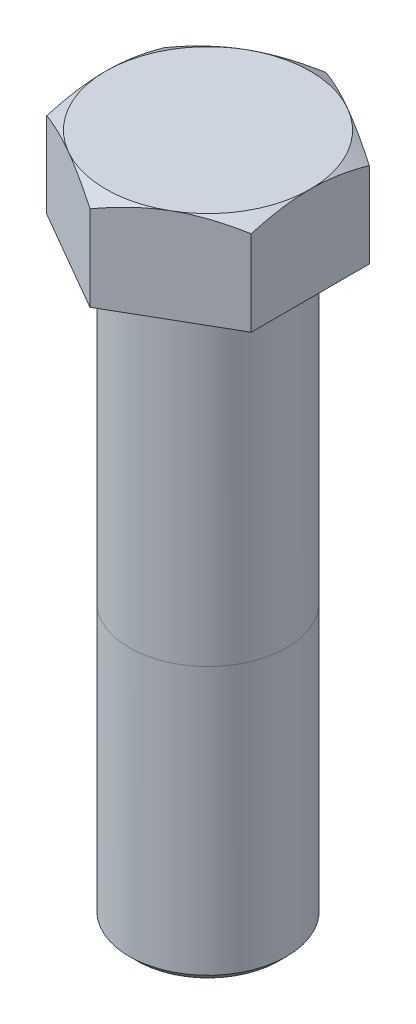
ISO-10303-21;
HEADER;
FILE_DESCRIPTION(('STEP AP214'),'2;1');
FILE_NAME('part.step','',(''),(''),'','','');
FILE_SCHEMA(('AUTOMOTIVE_DESIGN { 1 0 10303 214 1 1 1 1 }'));
ENDSEC;
DATA;
#1=APPLICATION_CONTEXT('core data for automotive mechanical design processes');
#2=APPLICATION_PROTOCOL_DEFINITION('international standard','automotive_design',2000,#1);
#3=PRODUCT_CONTEXT('',#1,'mechanical');
#4=PRODUCT('Part','Part','',(#3));
#5=PRODUCT_RELATED_PRODUCT_CATEGORY('part','',(#4));
#6=PRODUCT_DEFINITION_FORMATION('','',#4);
#7=PRODUCT_DEFINITION_CONTEXT('part definition',#1,'design');
#8=PRODUCT_DEFINITION('design','',#6,#7);
#9=PRODUCT_DEFINITION_SHAPE('','',#8);
#10=(LENGTH_UNIT() NAMED_UNIT(*) SI_UNIT(.MILLI.,.METRE.));
#11=(NAMED_UNIT(*) PLANE_ANGLE_UNIT() SI_UNIT($,.RADIAN.));
#12=(NAMED_UNIT(*) SI_UNIT($,.STERADIAN.) SOLID_ANGLE_UNIT());
#13=UNCERTAINTY_MEASURE_WITH_UNIT(LENGTH_MEASURE(1.E-05),#10,'distance_accuracy_value','');
#14=(GEOMETRIC_REPRESENTATION_CONTEXT(3) GLOBAL_UNCERTAINTY_ASSIGNED_CONTEXT((#13)) GLOBAL_UNIT_ASSIGNED_CONTEXT((#10,
#11,#12)) REPRESENTATION_CONTEXT('',''));
#15=CARTESIAN_POINT('',(0.,0.,0.));
#16=DIRECTION('',(0.,0.,1.));
#17=DIRECTION('',(1.,0.,0.));
#18=AXIS2_PLACEMENT_3D('',#15,#16,#17);
#19=CARTESIAN_POINT('',(0.,-75.,0.));
#20=DIRECTION('',(0.,1.,0.));
#21=DIRECTION('',(0.,0.,1.));
#22=AXIS2_PLACEMENT_3D('',#19,#20,#21);
#23=CYLINDRICAL_SURFACE('',#22,10.);
#24=CARTESIAN_POINT('',(0.,-74.,0.));
#25=DIRECTION('',(0.,-1.,0.));
#26=DIRECTION('',(0.,0.,-1.));
#27=AXIS2_PLACEMENT_3D('',#24,#25,#26);
#28=CIRCLE('',#27,10.);
#29=CARTESIAN_POINT('',(0.,-74.,-10.));
#30=VERTEX_POINT('',#29);
#31=EDGE_CURVE('E246',#30,#30,#28,.F.);
#32=ORIENTED_EDGE('',*,*,#31,.T.);
#33=EDGE_LOOP('',(#32));
#34=FACE_BOUND('',#33,.T.);
#35=CARTESIAN_POINT('',(0.,-40.,0.));
#36=DIRECTION('',(0.,1.,0.));
#37=DIRECTION('',(0.,0.,1.));
#38=AXIS2_PLACEMENT_3D('',#35,#36,#37);
#39=CIRCLE('',#38,10.);
#40=CARTESIAN_POINT('',(9.99999999999998,-40.,0.));
#41=VERTEX_POINT('',#40);
#42=CARTESIAN_POINT('',(-10.,-40.,0.));
#43=VERTEX_POINT('',#42);
#44=EDGE_CURVE('E14',#41,#43,#39,.T.);
#45=ORIENTED_EDGE('',*,*,#44,.F.);
#46=EDGE_CURVE('E51',#43,#41,#39,.T.);
#47=ORIENTED_EDGE('',*,*,#46,.F.);
#48=EDGE_LOOP('',(#45,#47));
#49=FACE_BOUND('',#48,.T.);
#50=ADVANCED_FACE('F47',(#34,#49),#23,.T.);
#51=CARTESIAN_POINT('',(13.,12.,7.50555349946511));
#52=DIRECTION('',(-1.,0.,0.));
#53=DIRECTION('',(0.,0.,1.));
#54=AXIS2_PLACEMENT_3D('',#51,#52,#53);
#55=PLANE('',#54);
#56=CARTESIAN_POINT('',(13.,5.47302312919701,-20.5362052428753));
#57=CARTESIAN_POINT('',(12.9999999999999,5.6123181993156,-20.2506559799709));
#58=CARTESIAN_POINT('',(12.9999999999999,5.75094643819101,-19.9647815771176));
#59=CARTESIAN_POINT('',(12.9999999999999,6.0267189120986,-19.3923147600184));
#60=CARTESIAN_POINT('',(12.9999999999999,6.16386313329287,-19.1057223391078));
#61=CARTESIAN_POINT('',(12.9999999999999,6.57287807441499,-18.2446950824058));
#62=CARTESIAN_POINT('',(12.9999999999999,6.8422924694262,-17.6690891780608));
#63=CARTESIAN_POINT('',(12.9999999999999,7.37438213181202,-16.5111922340489));
#64=CARTESIAN_POINT('',(12.9999999999999,7.63701584924481,-15.9288820570642));
#65=CARTESIAN_POINT('',(12.9999999999999,8.15202747920568,-14.7597595446431));
#66=CARTESIAN_POINT('',(12.9999999999999,8.40440585273383,-14.1729474129924));
#67=CARTESIAN_POINT('',(12.9999999999999,8.9046256550839,-12.9736996469937));
#68=CARTESIAN_POINT('',(12.9999999999999,9.1520156484003,-12.3610747680026));
#69=CARTESIAN_POINT('',(12.9999999999999,9.62896591516343,-11.1287938015243));
#70=CARTESIAN_POINT('',(13.,9.85852424154899,-10.5091369546508));
#71=CARTESIAN_POINT('',(12.9999999999999,10.2940551669296,-9.26286823696078));
#72=CARTESIAN_POINT('',(12.9999999999999,10.5000724096716,-8.63627208859659));
#73=CARTESIAN_POINT('',(13.,10.8821740841937,-7.37404234614446));
#74=CARTESIAN_POINT('',(13.,11.0582675535848,-6.73841154378601));
#75=CARTESIAN_POINT('',(13.,11.2933057679572,-5.77979070520041));
#76=CARTESIAN_POINT('',(13.,11.3666331056824,-5.46030810975037));
#77=CARTESIAN_POINT('',(12.9999999999999,11.5027463999533,-4.81909359478802));
#78=CARTESIAN_POINT('',(12.9999999999999,11.5655325543713,-4.49736171761586));
#79=CARTESIAN_POINT('',(13.,11.679479670437,-3.85184384003502));
#80=CARTESIAN_POINT('',(13.,11.7306409256578,-3.52805789171178));
#81=CARTESIAN_POINT('',(13.,11.820333330158,-2.87874422062102));
#82=CARTESIAN_POINT('',(13.,11.8588650554156,-2.55321657797298));
#83=CARTESIAN_POINT('',(13.,11.9220283095709,-1.9052855999215));
#84=CARTESIAN_POINT('',(13.,11.946842114415,-1.58290014435152));
#85=CARTESIAN_POINT('',(13.,11.9827999679473,-0.937368113080149));
#86=CARTESIAN_POINT('',(13.,11.9939442543354,-0.61422155071159));
#87=CARTESIAN_POINT('',(13.,12.0022958533878,0.0322565326583396));
#88=CARTESIAN_POINT('',(13.,11.9995030984212,0.355588054549631));
#89=CARTESIAN_POINT('',(13.,11.9800526045551,1.00183711607913));
#90=CARTESIAN_POINT('',(13.,11.9633942530549,1.32475463679487));
#91=CARTESIAN_POINT('',(13.,11.9078771446615,2.0896150790429));
#92=CARTESIAN_POINT('',(13.,11.8630640449832,2.53113595347257));
#93=CARTESIAN_POINT('',(13.,11.7498781130193,3.41112300001199));
#94=CARTESIAN_POINT('',(13.,11.6815023932615,3.84958879101613));
#95=CARTESIAN_POINT('',(13.,11.4446391068226,5.15976502996832));
#96=CARTESIAN_POINT('',(13.,11.2444502612508,6.02583270000573));
#97=CARTESIAN_POINT('',(13.,10.8944076885502,7.32162047581373));
#98=CARTESIAN_POINT('',(13.,10.7676827319449,7.757977110938));
#99=CARTESIAN_POINT('',(13.,10.5003525824954,8.62645996834518));
#100=CARTESIAN_POINT('',(13.,10.3597472804184,9.05858615730673));
#101=CARTESIAN_POINT('',(13.,10.0669695445201,9.91873384330734));
#102=CARTESIAN_POINT('',(13.,9.91480025359072,10.3467564202751));
#103=CARTESIAN_POINT('',(13.,9.60076374475677,11.1992081828991));
#104=CARTESIAN_POINT('',(13.,9.43889676356815,11.6236374559779));
#105=CARTESIAN_POINT('',(13.,9.12870574483411,12.4140886026434));
#106=CARTESIAN_POINT('',(13.,8.98137287033611,12.7805010710647));
#107=CARTESIAN_POINT('',(13.,8.68142119135482,13.5111591236827));
#108=CARTESIAN_POINT('',(13.,8.52880229582055,13.8754046704277));
#109=CARTESIAN_POINT('',(13.,8.06411516601984,14.9653023909476));
#110=CARTESIAN_POINT('',(13.,7.74524090533267,15.6880541659425));
#111=CARTESIAN_POINT('',(13.,7.09376791723235,17.1276583875994));
#112=CARTESIAN_POINT('',(13.,6.76116364311448,17.8445083069251));
#113=CARTESIAN_POINT('',(13.,6.08554657750159,19.2732364565627));
#114=CARTESIAN_POINT('',(13.,5.74253424136572,19.9851149027082));
#115=CARTESIAN_POINT('',(13.,5.04782369692459,21.4060922865842));
#116=CARTESIAN_POINT('',(13.,4.69611186951812,22.1151845489984));
#117=CARTESIAN_POINT('',(13.,3.986261020148,23.5301475016115));
#118=CARTESIAN_POINT('',(13.,3.62812194056714,24.2360181628591));
#119=CARTESIAN_POINT('',(13.,2.90677965391014,25.644957694335));
#120=CARTESIAN_POINT('',(13.,2.54357763785105,26.3480271751018));
#121=CARTESIAN_POINT('',(13.,1.81299046215743,27.7519839052317));
#122=CARTESIAN_POINT('',(13.,1.44560531694706,28.452871162109));
#123=CARTESIAN_POINT('',(13.,0.418343166699492,30.4010576783747));
#124=CARTESIAN_POINT('',(13.,-0.245263220807709,31.6463900252864));
#125=CARTESIAN_POINT('',(13.,-1.58036517961358,34.1329142743419));
#126=CARTESIAN_POINT('',(13.,-2.25186126679987,35.3741058988443));
#127=CARTESIAN_POINT('',(13.,-3.59837608390633,37.8489823521331));
#128=CARTESIAN_POINT('',(13.,-4.27337443605208,39.0826782750488));
#129=CARTESIAN_POINT('',(13.,-5.28919201118936,40.9313296910316));
#130=CARTESIAN_POINT('',(13.,-5.6283372544577,41.5472062363514));
#131=CARTESIAN_POINT('',(13.,-6.30761910492575,42.7784114282018));
#132=CARTESIAN_POINT('',(13.,-6.64775571090814,43.3937400754039));
#133=CARTESIAN_POINT('',(13.0000000000001,-6.98832622530923,44.0088285303353));
#134=B_SPLINE_CURVE_WITH_KNOTS('',3,(#56,#57,#58,#59,#60,#61,#62,#63,#64,#65,#66,#67,#68,#69,
#70,#71,#72,#73,#74,#75,#76,#77,#78,#79,#80,#81,#82,#83,#84,#85,#86,#87,#88,#89,#90,#91,#92,#93,
#94,#95,#96,#97,#98,#99,#100,#101,#102,#103,#104,#105,#106,#107,#108,#109,#110,#111,#112,#113,
#114,#115,#116,#117,#118,#119,#120,#121,#122,#123,#124,#125,#126,#127,#128,#129,#130,#131,#132,
#133),.UNSPECIFIED.,.F.,.F.,(4,2,2,2,2,2,2,2,2,2,2,2,2,2,2,2,2,2,2,2,2,2,2,2,2,2,2,2,2,2,2,2,2,
2,2,2,2,2,4),(0.,0.953137143504383,1.90628316701682,3.81283878003332,5.72915255951741,
7.64538010101131,9.62723751771698,11.6093110325104,13.5875610336447,15.5652124955241,
16.5484355945027,17.5316402349971,18.5148200430678,19.4979550063206,20.4676917853032,
21.4374117012485,22.4071363228599,23.3769037904805,24.7075277474215,26.0383148231711,
28.7011524606477,30.0641851061431,31.4272284790177,32.7899027161321,34.1525437045621,
35.3372707337203,36.5220181797948,38.8917114597028,41.2623716102642,43.6329281921008,
46.0074657211912,48.3820245475033,50.7560339004247,53.1300350698181,57.3633151213702,
61.5968735342,65.8157059354961,67.9249493924729,70.034190260563),.UNSPECIFIED.);
#135=CARTESIAN_POINT('',(13.,10.8388868327985,7.50555349946511));
#136=VERTEX_POINT('',#135);
#137=CARTESIAN_POINT('',(13.,12.,0.));
#138=VERTEX_POINT('',#137);
#139=EDGE_CURVE('E120',#136,#138,#134,.F.);
#140=ORIENTED_EDGE('',*,*,#139,.F.);
#141=DIRECTION('',(0.,-1.,0.));
#142=VECTOR('',#141,1.);
#143=CARTESIAN_POINT('',(13.,12.,7.50555349946511));
#144=LINE('',#143,#142);
#145=CARTESIAN_POINT('',(13.,0.,7.50555349946511));
#146=VERTEX_POINT('',#145);
#147=EDGE_CURVE('E261',#136,#146,#144,.T.);
#148=ORIENTED_EDGE('',*,*,#147,.T.);
#149=DIRECTION('',(0.,0.,-1.));
#150=VECTOR('',#149,1.);
#151=CARTESIAN_POINT('',(13.,0.,7.50555349946511));
#152=LINE('',#151,#150);
#153=CARTESIAN_POINT('',(13.,0.,-7.50555349946516));
#154=VERTEX_POINT('',#153);
#155=EDGE_CURVE('E130',#146,#154,#152,.T.);
#156=ORIENTED_EDGE('',*,*,#155,.T.);
#157=DIRECTION('',(0.,-1.,0.));
#158=VECTOR('',#157,1.);
#159=CARTESIAN_POINT('',(13.,12.,-7.50555349946516));
#160=LINE('',#159,#158);
#161=CARTESIAN_POINT('',(13.,10.8388868327985,-7.50555349946516));
#162=VERTEX_POINT('',#161);
#163=EDGE_CURVE('E155',#162,#154,#160,.T.);
#164=ORIENTED_EDGE('',*,*,#163,.F.);
#165=EDGE_CURVE('E131',#138,#162,#134,.F.);
#166=ORIENTED_EDGE('',*,*,#165,.F.);
#167=EDGE_LOOP('',(#140,#148,#156,#164,#166));
#168=FACE_BOUND('',#167,.T.);
#169=ADVANCED_FACE('F153',(#168),#55,.F.);
#170=CARTESIAN_POINT('',(13.,12.,-7.50555349946516));
#171=DIRECTION('',(-0.5,0.,0.866025403784439));
#172=DIRECTION('',(0.866025403784439,0.,0.500000000000001));
#173=AXIS2_PLACEMENT_3D('',#170,#171,#172);
#174=PLANE('',#173);
#175=CARTESIAN_POINT('',(13.0001999999999,10.8388201653626,-7.50543802941131));
#176=CARTESIAN_POINT('',(12.7144648850697,10.9340592607737,-7.67040727493323));
#177=CARTESIAN_POINT('',(12.4276152495064,11.0249766112314,-7.83601998924266));
#178=CARTESIAN_POINT('',(11.8516157789271,11.1969665208061,-8.16857343863473));
#179=CARTESIAN_POINT('',(11.5624652205073,11.2780358419941,-8.33551459137472));
#180=CARTESIAN_POINT('',(10.9813050785948,11.4292399600852,-8.67104755575018));
#181=CARTESIAN_POINT('',(10.6892904094912,11.4993488854031,-8.83964230356445));
#182=CARTESIAN_POINT('',(10.1032319146354,11.6271267685936,-9.17800333333032));
#183=CARTESIAN_POINT('',(9.80918820563259,11.684796436153,-9.34776954787661));
#184=CARTESIAN_POINT('',(9.22660617586339,11.7852429107094,-9.6841234395889));
#185=CARTESIAN_POINT('',(8.93811110693475,11.8283521763088,-9.85068614529472));
#186=CARTESIAN_POINT('',(8.35979901670926,11.9006370020862,-10.184574786262));
#187=CARTESIAN_POINT('',(8.06998197007602,11.9298122940701,-10.3519007361515));
#188=CARTESIAN_POINT('',(7.48986101370733,11.9734925129694,-10.6868337264735));
#189=CARTESIAN_POINT('',(7.19955809509021,11.9880148729439,-10.8544401946836));
#190=CARTESIAN_POINT('',(6.61868426662947,12.0020769130485,-11.1898078559106));
#191=CARTESIAN_POINT('',(6.32811336534372,12.0016170561171,-11.3575690439866));
#192=CARTESIAN_POINT('',(5.78489148969083,11.9867610928037,-11.6711983401245));
#193=CARTESIAN_POINT('',(5.53220180638652,11.9741770566899,-11.8170887968017));
#194=CARTESIAN_POINT('',(5.02740368266753,11.9379156201946,-12.1085341294173));
#195=CARTESIAN_POINT('',(4.77529528463438,11.9142374351328,-12.2540889808867));
#196=CARTESIAN_POINT('',(4.27179666903782,11.8562005500844,-12.544784042138));
#197=CARTESIAN_POINT('',(4.02040721834163,11.8218330287471,-12.6899238091688));
#198=CARTESIAN_POINT('',(3.51880688407628,11.7430204493894,-12.9795228971825));
#199=CARTESIAN_POINT('',(3.26859608181068,11.6985747062674,-13.1239821712247));
#200=CARTESIAN_POINT('',(2.50906721513482,11.5489966092185,-13.5624963668573));
#201=CARTESIAN_POINT('',(2.00194863635103,11.4289496815176,-13.8552814148292));
#202=CARTESIAN_POINT('',(0.995273291325103,11.1564921660602,-14.4364856962665));
#203=CARTESIAN_POINT('',(0.49570363599023,11.0041455670387,-14.7249123712531));
#204=CARTESIAN_POINT('',(-0.000200000000005751,10.8388201653626,-15.0112224689841));
#205=B_SPLINE_CURVE_WITH_KNOTS('',3,(#175,#176,#177,#178,#179,#180,#181,#182,#183,#184,#185,
#186,#187,#188,#189,#190,#191,#192,#193,#194,#195,#196,#197,#198,#199,#200,#201,#202,#203,#204),
.UNSPECIFIED.,.F.,.F.,(4,2,2,2,2,2,2,2,2,2,2,2,2,2,4),(0.,1.03025461984709,2.0608470650412,
3.09383660213902,4.12676718933493,5.13420251692741,6.14165723434359,7.14791193250861,
8.15413553822912,9.03008081731203,9.90608806065232,10.7828201537635,11.6596118636231,
13.4517531627236,15.240376691212),.UNSPECIFIED.);
#206=CARTESIAN_POINT('',(6.50000000000001,12.,-11.2583302491977));
#207=VERTEX_POINT('',#206);
#208=EDGE_CURVE('E138',#162,#207,#205,.T.);
#209=ORIENTED_EDGE('',*,*,#208,.F.);
#210=ORIENTED_EDGE('',*,*,#163,.T.);
#211=DIRECTION('',(-0.866025403784439,0.,-0.500000000000001));
#212=VECTOR('',#211,1.);
#213=CARTESIAN_POINT('',(13.,0.,-7.50555349946516));
#214=LINE('',#213,#212);
#215=CARTESIAN_POINT('',(0.,0.,-15.0111069989303));
#216=VERTEX_POINT('',#215);
#217=EDGE_CURVE('E274',#154,#216,#214,.T.);
#218=ORIENTED_EDGE('',*,*,#217,.T.);
#219=DIRECTION('',(0.,-1.,0.));
#220=VECTOR('',#219,1.);
#221=CARTESIAN_POINT('',(0.,12.,-15.0111069989303));
#222=LINE('',#221,#220);
#223=CARTESIAN_POINT('',(0.,10.8388868327985,-15.0111069989303));
#224=VERTEX_POINT('',#223);
#225=EDGE_CURVE('E253',#224,#216,#222,.T.);
#226=ORIENTED_EDGE('',*,*,#225,.F.);
#227=EDGE_CURVE('E156',#207,#224,#205,.T.);
#228=ORIENTED_EDGE('',*,*,#227,.F.);
#229=EDGE_LOOP('',(#209,#210,#218,#226,#228));
#230=FACE_BOUND('',#229,.T.);
#231=ADVANCED_FACE('F174',(#230),#174,.F.);
#232=CARTESIAN_POINT('',(0.,12.,-15.0111069989303));
#233=DIRECTION('',(0.500000000000001,0.,0.866025403784439));
#234=DIRECTION('',(0.866025403784439,0.,-0.500000000000001));
#235=AXIS2_PLACEMENT_3D('',#232,#233,#234);
#236=PLANE('',#235);
#237=CARTESIAN_POINT('',(0.000200000000005751,10.8388201653626,-15.0112224689841));
#238=CARTESIAN_POINT('',(-0.285535114930224,10.9340592607736,-14.8462532234622));
#239=CARTESIAN_POINT('',(-0.572384750493512,11.0249766112314,-14.6806405091528));
#240=CARTESIAN_POINT('',(-1.14838422107285,11.1969665208061,-14.3480870597607));
#241=CARTESIAN_POINT('',(-1.43753477949264,11.2780358419941,-14.1811459070207));
#242=CARTESIAN_POINT('',(-2.01869492140515,11.4292399600852,-13.8456129426453));
#243=CARTESIAN_POINT('',(-2.31070959050871,11.4993488854031,-13.677018194831));
#244=CARTESIAN_POINT('',(-2.89676808536453,11.6271267685936,-13.3386571650651));
#245=CARTESIAN_POINT('',(-3.19081179436734,11.684796436153,-13.1688909505188));
#246=CARTESIAN_POINT('',(-3.77339382413655,11.7852429107094,-12.8325370588065));
#247=CARTESIAN_POINT('',(-4.06188889306518,11.8283521763088,-12.6659743531007));
#248=CARTESIAN_POINT('',(-4.64020098329068,11.9006370020862,-12.3320857121334));
#249=CARTESIAN_POINT('',(-4.93001802992392,11.9298122940701,-12.164759762244));
#250=CARTESIAN_POINT('',(-5.5101389862926,11.9734925129694,-11.829826771922));
#251=CARTESIAN_POINT('',(-5.80044190490972,11.9880148729439,-11.6622203037118));
#252=CARTESIAN_POINT('',(-6.38131573337048,12.0020769130485,-11.3268526424848));
#253=CARTESIAN_POINT('',(-6.67188663465623,12.0016170561171,-11.1590914544088));
#254=CARTESIAN_POINT('',(-7.21510851030913,11.9867610928037,-10.8454621582709));
#255=CARTESIAN_POINT('',(-7.46779819361343,11.97417705669,-10.6995717015937));
#256=CARTESIAN_POINT('',(-7.97259631733242,11.9379156201946,-10.4081263689782));
#257=CARTESIAN_POINT('',(-8.22470471536557,11.9142374351328,-10.2625715175088));
#258=CARTESIAN_POINT('',(-8.72820333096214,11.8562005500845,-9.97187645625747));
#259=CARTESIAN_POINT('',(-8.97959278165833,11.8218330287471,-9.82673668922659));
#260=CARTESIAN_POINT('',(-9.48119311592368,11.7430204493894,-9.53713760121289));
#261=CARTESIAN_POINT('',(-9.73140391818928,11.6985747062674,-9.39267832717069));
#262=CARTESIAN_POINT('',(-10.4909327848651,11.5489966092185,-8.95416413153808));
#263=CARTESIAN_POINT('',(-10.9980513636489,11.4289496815176,-8.6613790835662));
#264=CARTESIAN_POINT('',(-12.0047267086749,11.1564921660602,-8.08017480212892));
#265=CARTESIAN_POINT('',(-12.5042963640098,11.0041455670387,-7.79174812714237));
#266=CARTESIAN_POINT('',(-13.0002,10.8388201653626,-7.50543802941131));
#267=B_SPLINE_CURVE_WITH_KNOTS('',3,(#237,#238,#239,#240,#241,#242,#243,#244,#245,#246,#247,
#248,#249,#250,#251,#252,#253,#254,#255,#256,#257,#258,#259,#260,#261,#262,#263,#264,#265,#266),
.UNSPECIFIED.,.F.,.F.,(4,2,2,2,2,2,2,2,2,2,2,2,2,2,4),(0.,1.03025461984709,2.06084706504121,
3.09383660213902,4.12676718933494,5.13420251692743,6.1416572343436,7.14791193250863,
8.15413553822914,9.03008081731206,9.90608806065236,10.7828201537635,11.6596118636232,
13.4517531627237,15.2403766912121),.UNSPECIFIED.);
#268=CARTESIAN_POINT('',(-6.50000000000006,12.,-11.2583302491978));
#269=VERTEX_POINT('',#268);
#270=EDGE_CURVE('E192',#224,#269,#267,.T.);
#271=ORIENTED_EDGE('',*,*,#270,.F.);
#272=ORIENTED_EDGE('',*,*,#225,.T.);
#273=DIRECTION('',(-0.866025403784439,0.,0.500000000000001));
#274=VECTOR('',#273,1.);
#275=CARTESIAN_POINT('',(0.,0.,-15.0111069989303));
#276=LINE('',#275,#274);
#277=CARTESIAN_POINT('',(-13.0000000000001,0.,-7.50555349946515));
#278=VERTEX_POINT('',#277);
#279=EDGE_CURVE('E272',#216,#278,#276,.T.);
#280=ORIENTED_EDGE('',*,*,#279,.T.);
#281=DIRECTION('',(0.,-1.,0.));
#282=VECTOR('',#281,1.);
#283=CARTESIAN_POINT('',(-13.0000000000001,12.,-7.50555349946515));
#284=LINE('',#283,#282);
#285=CARTESIAN_POINT('',(-13.0000000000001,10.8388868327985,-7.50555349946515));
#286=VERTEX_POINT('',#285);
#287=EDGE_CURVE('E255',#286,#278,#284,.T.);
#288=ORIENTED_EDGE('',*,*,#287,.F.);
#289=EDGE_CURVE('E187',#269,#286,#267,.T.);
#290=ORIENTED_EDGE('',*,*,#289,.F.);
#291=EDGE_LOOP('',(#271,#272,#280,#288,#290));
#292=FACE_BOUND('',#291,.T.);
#293=ADVANCED_FACE('F178',(#292),#236,.F.);
#294=CARTESIAN_POINT('',(-13.0000000000001,12.,-7.50555349946515));
#295=DIRECTION('',(1.,0.,0.));
#296=DIRECTION('',(0.,0.,-1.));
#297=AXIS2_PLACEMENT_3D('',#294,#295,#296);
#298=PLANE('',#297);
#299=CARTESIAN_POINT('',(-13.0000000000001,5.47302311942427,-20.5362052629085));
#300=CARTESIAN_POINT('',(-13.0000000000001,5.6123181897463,-20.2506559996668));
#301=CARTESIAN_POINT('',(-13.0000000000001,5.75094642882505,-19.964781596476));
#302=CARTESIAN_POINT('',(-13.0000000000001,6.02671890313898,-19.3923147787013));
#303=CARTESIAN_POINT('',(-13.0000000000001,6.16386312453624,-19.1057223574529));
#304=CARTESIAN_POINT('',(-13.0000000000001,6.57287806626668,-18.2446950997364));
#305=CARTESIAN_POINT('',(-13.0000000000001,6.8422924616825,-17.6690891947142));
#306=CARTESIAN_POINT('',(-13.0000000000001,7.37438212487768,-16.5111922493377));
#307=CARTESIAN_POINT('',(-13.0000000000001,7.63701584271513,-15.9288820716656));
#308=CARTESIAN_POINT('',(-13.0000000000001,8.15202747347874,-14.7597595578652));
#309=CARTESIAN_POINT('',(-13.0000000000001,8.40440584740494,-14.1729474255224));
#310=CARTESIAN_POINT('',(-13.0000000000001,8.90462565056392,-12.973699658084));
#311=CARTESIAN_POINT('',(-13.0000000000001,9.15201564429021,-12.3610747783447));
#312=CARTESIAN_POINT('',(-13.0000000000001,9.62896591185156,-11.1287938103579));
#313=CARTESIAN_POINT('',(-13.0000000000001,9.85852423862546,-10.5091369627242));
#314=CARTESIAN_POINT('',(-13.0000000000001,10.2940551647462,-9.26286824349996));
#315=CARTESIAN_POINT('',(-13.0000000000001,10.5000724078401,-8.63627209436172));
#316=CARTESIAN_POINT('',(-13.0000000000001,10.8821740830097,-7.37404235034036));
#317=CARTESIAN_POINT('',(-13.,11.0582675526963,-6.73841154718673));
#318=CARTESIAN_POINT('',(-13.,11.2933057674937,-5.7797907072017));
#319=CARTESIAN_POINT('',(-13.0000000000001,11.3666331053749,-5.46030811115524));
#320=CARTESIAN_POINT('',(-13.0000000000001,11.5027463999193,-4.81909359499143));
#321=CARTESIAN_POINT('',(-13.0000000000001,11.5655325544546,-4.49736171721424));
#322=CARTESIAN_POINT('',(-13.0000000000001,11.6794796707102,-3.8518438384165));
#323=CARTESIAN_POINT('',(-13.0000000000001,11.7306409260033,-3.52805788948138));
#324=CARTESIAN_POINT('',(-13.0000000000001,11.8203333305982,-2.87874421716142));
#325=CARTESIAN_POINT('',(-13.0000000000001,11.8588650558781,-2.55321657389604));
#326=CARTESIAN_POINT('',(-13.0000000000001,11.9220283100231,-1.9052855946228));
#327=CARTESIAN_POINT('',(-13.0000000000001,11.9468421148357,-1.58290013844844));
#328=CARTESIAN_POINT('',(-13.0000000000001,11.9827999682513,-0.937368105969223));
#329=CARTESIAN_POINT('',(-13.0000000000001,11.9939442545542,-0.614221542997186));
#330=CARTESIAN_POINT('',(-13.0000000000001,12.0022958533836,0.0322565415754331));
#331=CARTESIAN_POINT('',(-13.0000000000001,11.9995030982792,0.355588064065937));
#332=CARTESIAN_POINT('',(-13.0000000000001,11.9800526040882,1.00183712678611));
#333=CARTESIAN_POINT('',(-13.,11.9633942524011,1.32475464809332));
#334=CARTESIAN_POINT('',(-13.,11.9078771435481,2.08961509124377));
#335=CARTESIAN_POINT('',(-13.0000000000001,11.863064043606,2.53113596598188));
#336=CARTESIAN_POINT('',(-13.0000000000001,11.7498781111005,3.41112301312391));
#337=CARTESIAN_POINT('',(-13.0000000000001,11.6815023910652,3.84958880442221));
#338=CARTESIAN_POINT('',(-13.0000000000001,11.4446391037876,5.15976504424042));
#339=CARTESIAN_POINT('',(-13.0000000000001,11.2444502576496,6.02583271483174));
#340=CARTESIAN_POINT('',(-13.0000000000001,10.8944076841142,7.32162049146811));
#341=CARTESIAN_POINT('',(-13.0000000000001,10.7676827272287,7.75797712687464));
#342=CARTESIAN_POINT('',(-13.0000000000001,10.5003525772278,8.626459984843));
#343=CARTESIAN_POINT('',(-13.0000000000001,10.3597472748795,9.05858617408349));
#344=CARTESIAN_POINT('',(-13.0000000000001,10.0669695384487,9.91873386063978));
#345=CARTESIAN_POINT('',(-13.0000000000001,9.91480024725813,10.3467564378843));
#346=CARTESIAN_POINT('',(-13.,9.60076373791119,11.1992082010619));
#347=CARTESIAN_POINT('',(-12.9999999999999,9.4388967564708,11.6236374744174));
#348=CARTESIAN_POINT('',(-13.,9.12870573739348,12.4140886212969));
#349=CARTESIAN_POINT('',(-13.0000000000001,8.98137286280801,12.7805010896573));
#350=CARTESIAN_POINT('',(-13.0000000000001,8.68142118366587,13.5111591421578));
#351=CARTESIAN_POINT('',(-13.0000000000001,8.52880228805823,13.8754046888461));
#352=CARTESIAN_POINT('',(-13.0000000000001,8.06411515805513,14.9653024092016));
#353=CARTESIAN_POINT('',(-13.0000000000001,7.74524089725656,15.6880541840945));
#354=CARTESIAN_POINT('',(-13.0000000000001,7.09376790896714,17.1276584055583));
#355=CARTESIAN_POINT('',(-13.0000000000001,6.76116363477161,17.844508324793));
#356=CARTESIAN_POINT('',(-13.0000000000001,6.08554656902704,19.2732364742586));
#357=CARTESIAN_POINT('',(-13.0000000000001,5.74253423283716,19.9851149203229));
#358=CARTESIAN_POINT('',(-13.0000000000001,5.04782368830773,21.4060923040388));
#359=CARTESIAN_POINT('',(-13.0000000000001,4.69611186086705,22.1151845663742));
#360=CARTESIAN_POINT('',(-13.0000000000001,3.98626101144136,23.5301475188353));
#361=CARTESIAN_POINT('',(-13.0000000000001,3.62812193183916,24.2360181800098));
#362=CARTESIAN_POINT('',(-13.0000000000001,2.90677964514867,25.644957711345));
#363=CARTESIAN_POINT('',(-13.0000000000001,2.54357762907744,26.3480271920441));
#364=CARTESIAN_POINT('',(-13.0000000000001,1.81299045336684,27.7519839220423));
#365=CARTESIAN_POINT('',(-13.0000000000001,1.44560530815166,28.4528711788555));
#366=CARTESIAN_POINT('',(-13.0000000000001,0.418343157841397,30.4010576950551));
#367=CARTESIAN_POINT('',(-13.0000000000001,-0.245263229718481,31.6463900419673));
#368=CARTESIAN_POINT('',(-13.0000000000001,-1.58036518861903,34.1329142910288));
#369=CARTESIAN_POINT('',(-13.0000000000001,-2.25186127584733,35.3741059155367));
#370=CARTESIAN_POINT('',(-13.0000000000001,-3.59837609304068,37.8489823688588));
#371=CARTESIAN_POINT('',(-13.0000000000001,-4.27337444523145,39.0826782918024));
#372=CARTESIAN_POINT('',(-13.0000000000001,-5.28919202043271,40.9313297078291));
#373=CARTESIAN_POINT('',(-13.0000000000001,-5.62833726372186,41.5472062531641));
#374=CARTESIAN_POINT('',(-13.0000000000001,-6.30761911423045,42.7784114450453));
#375=CARTESIAN_POINT('',(-13.,-6.64775572023259,43.3937400922632));
#376=CARTESIAN_POINT('',(-13.,-6.98832623465298,44.0088285472104));
#377=B_SPLINE_CURVE_WITH_KNOTS('',3,(#299,#300,#301,#302,#303,#304,#305,#306,#307,#308,#309,
#310,#311,#312,#313,#314,#315,#316,#317,#318,#319,#320,#321,#322,#323,#324,#325,#326,#327,#328,
#329,#330,#331,#332,#333,#334,#335,#336,#337,#338,#339,#340,#341,#342,#343,#344,#345,#346,#347,
#348,#349,#350,#351,#352,#353,#354,#355,#356,#357,#358,#359,#360,#361,#362,#363,#364,#365,#366,
#367,#368,#369,#370,#371,#372,#373,#374,#375,#376),.UNSPECIFIED.,.F.,.F.,(4,2,2,2,2,2,2,2,2,2,2,
2,2,2,2,2,2,2,2,2,2,2,2,2,2,2,2,2,2,2,2,2,2,2,2,2,2,2,4),(0.,0.953137144681599,1.90628316937126,
3.81283878474253,5.72915256660556,7.64538011047822,9.62723752972566,11.6093110470617,
13.5875610507306,15.5652125151425,16.5484356159691,17.5316402583113,18.5148200682277,
19.4979550333258,20.4676918141073,21.4374117318513,22.4071363552623,23.3769038246823,
24.7075277826233,26.0383148593729,28.7011524988541,30.0641851453975,31.42722851932,
32.7899027574796,34.1525437469548,35.3372707760417,36.5220182220447,38.8917115018087,
41.2623716522209,43.6329282339089,46.007465762833,48.3820245889787,50.7560339417365,
53.1300351109665,57.3633151625944,61.5968735754985,65.8157059769328,67.9249494339796,
70.0341903021395),.UNSPECIFIED.);
#378=CARTESIAN_POINT('',(-13.0000000000001,12.,0.));
#379=VERTEX_POINT('',#378);
#380=EDGE_CURVE('E193',#286,#379,#377,.T.);
#381=ORIENTED_EDGE('',*,*,#380,.F.);
#382=ORIENTED_EDGE('',*,*,#287,.T.);
#383=DIRECTION('',(0.,0.,1.));
#384=VECTOR('',#383,1.);
#385=CARTESIAN_POINT('',(-13.0000000000001,0.,-7.50555349946515));
#386=LINE('',#385,#384);
#387=CARTESIAN_POINT('',(-13.,0.,7.50555349946515));
#388=VERTEX_POINT('',#387);
#389=EDGE_CURVE('E269',#278,#388,#386,.T.);
#390=ORIENTED_EDGE('',*,*,#389,.T.);
#391=DIRECTION('',(0.,-1.,0.));
#392=VECTOR('',#391,1.);
#393=CARTESIAN_POINT('',(-13.,12.,7.50555349946515));
#394=LINE('',#393,#392);
#395=CARTESIAN_POINT('',(-13.,10.8388868327985,7.50555349946515));
#396=VERTEX_POINT('',#395);
#397=EDGE_CURVE('E257',#396,#388,#394,.T.);
#398=ORIENTED_EDGE('',*,*,#397,.F.);
#399=EDGE_CURVE('E194',#379,#396,#377,.T.);
#400=ORIENTED_EDGE('',*,*,#399,.F.);
#401=EDGE_LOOP('',(#381,#382,#390,#398,#400));
#402=FACE_BOUND('',#401,.T.);
#403=ADVANCED_FACE('F183',(#402),#298,.F.);
#404=CARTESIAN_POINT('',(-13.,12.,7.50555349946515));
#405=DIRECTION('',(0.5,0.,-0.866025403784439));
#406=DIRECTION('',(-0.866025403784439,0.,-0.500000000000001));
#407=AXIS2_PLACEMENT_3D('',#404,#405,#406);
#408=PLANE('',#407);
#409=CARTESIAN_POINT('',(-13.0002,10.8388201653626,7.5054380294113));
#410=CARTESIAN_POINT('',(-12.7144648850698,10.9340592607736,7.67040727493321));
#411=CARTESIAN_POINT('',(-12.4276152495065,11.0249766112314,7.83601998924263));
#412=CARTESIAN_POINT('',(-11.8516157789271,11.1969665208061,8.1685734386347));
#413=CARTESIAN_POINT('',(-11.5624652205073,11.2780358419941,8.33551459137469));
#414=CARTESIAN_POINT('',(-10.9813050785948,11.4292399600852,8.67104755575016));
#415=CARTESIAN_POINT('',(-10.6892904094913,11.4993488854031,8.83964230356442));
#416=CARTESIAN_POINT('',(-10.1032319146354,11.6271267685936,9.1780033333303));
#417=CARTESIAN_POINT('',(-9.80918820563263,11.684796436153,9.34776954787659));
#418=CARTESIAN_POINT('',(-9.22660617586342,11.7852429107093,9.68412343958888));
#419=CARTESIAN_POINT('',(-8.93811110693478,11.8283521763088,9.85068614529471));
#420=CARTESIAN_POINT('',(-8.35979901670928,11.9006370020862,10.184574786262));
#421=CARTESIAN_POINT('',(-8.06998197007604,11.9298122940701,10.3519007361515));
#422=CARTESIAN_POINT('',(-7.48986101370735,11.9734925129694,10.6868337264735));
#423=CARTESIAN_POINT('',(-7.19955809509023,11.9880148729439,10.8544401946836));
#424=CARTESIAN_POINT('',(-6.61868426662947,12.0020769130485,11.1898078559106));
#425=CARTESIAN_POINT('',(-6.32811336534372,12.0016170561171,11.3575690439866));
#426=CARTESIAN_POINT('',(-5.78489148969083,11.9867610928037,11.6711983401245));
#427=CARTESIAN_POINT('',(-5.53220180638653,11.9741770566899,11.8170887968017));
#428=CARTESIAN_POINT('',(-5.02740368266754,11.9379156201946,12.1085341294173));
#429=CARTESIAN_POINT('',(-4.7752952846344,11.9142374351328,12.2540889808867));
#430=CARTESIAN_POINT('',(-4.27179666903784,11.8562005500845,12.5447840421379));
#431=CARTESIAN_POINT('',(-4.02040721834165,11.8218330287471,12.6899238091688));
#432=CARTESIAN_POINT('',(-3.51880688407631,11.7430204493894,12.9795228971825));
#433=CARTESIAN_POINT('',(-3.26859608181071,11.6985747062674,13.1239821712247));
#434=CARTESIAN_POINT('',(-2.50906721513485,11.5489966092185,13.5624963668573));
#435=CARTESIAN_POINT('',(-2.00194863635107,11.4289496815176,13.8552814148292));
#436=CARTESIAN_POINT('',(-0.995273291325146,11.1564921660602,14.4364856962665));
#437=CARTESIAN_POINT('',(-0.495703635990278,11.0041455670387,14.724912371253));
#438=CARTESIAN_POINT('',(0.00019999999995024,10.8388201653626,15.0112224689841));
#439=B_SPLINE_CURVE_WITH_KNOTS('',3,(#409,#410,#411,#412,#413,#414,#415,#416,#417,#418,#419,
#420,#421,#422,#423,#424,#425,#426,#427,#428,#429,#430,#431,#432,#433,#434,#435,#436,#437,#438),
.UNSPECIFIED.,.F.,.F.,(4,2,2,2,2,2,2,2,2,2,2,2,2,2,4),(0.,1.0302546198471,2.06084706504122,
3.09383660213904,4.12676718933496,5.13420251692746,6.14165723434364,7.14791193250867,
8.15413553822919,9.0300808173121,9.90608806065238,10.7828201537635,11.6596118636232,
13.4517531627236,15.240376691212),.UNSPECIFIED.);
#440=CARTESIAN_POINT('',(-6.50000000000009,12.,11.2583302491977));
#441=VERTEX_POINT('',#440);
#442=EDGE_CURVE('E199',#396,#441,#439,.T.);
#443=ORIENTED_EDGE('',*,*,#442,.F.);
#444=ORIENTED_EDGE('',*,*,#397,.T.);
#445=DIRECTION('',(0.866025403784439,0.,0.500000000000001));
#446=VECTOR('',#445,1.);
#447=CARTESIAN_POINT('',(-13.,0.,7.50555349946515));
#448=LINE('',#447,#446);
#449=CARTESIAN_POINT('',(0.,0.,15.0111069989303));
#450=VERTEX_POINT('',#449);
#451=EDGE_CURVE('E266',#388,#450,#448,.T.);
#452=ORIENTED_EDGE('',*,*,#451,.T.);
#453=DIRECTION('',(0.,-1.,0.));
#454=VECTOR('',#453,1.);
#455=CARTESIAN_POINT('',(0.,12.,15.0111069989303));
#456=LINE('',#455,#454);
#457=CARTESIAN_POINT('',(0.,10.8388868327985,15.0111069989303));
#458=VERTEX_POINT('',#457);
#459=EDGE_CURVE('E259',#458,#450,#456,.T.);
#460=ORIENTED_EDGE('',*,*,#459,.F.);
#461=EDGE_CURVE('E200',#441,#458,#439,.T.);
#462=ORIENTED_EDGE('',*,*,#461,.F.);
#463=EDGE_LOOP('',(#443,#444,#452,#460,#462));
#464=FACE_BOUND('',#463,.T.);
#465=ADVANCED_FACE('F210',(#464),#408,.F.);
#466=CARTESIAN_POINT('',(0.,12.,15.0111069989303));
#467=DIRECTION('',(-0.500000000000001,0.,-0.866025403784439));
#468=DIRECTION('',(-0.866025403784439,0.,0.500000000000001));
#469=AXIS2_PLACEMENT_3D('',#466,#467,#468);
#470=PLANE('',#469);
#471=CARTESIAN_POINT('',(-0.000200000000061262,10.8388201653626,15.0112224689841));
#472=CARTESIAN_POINT('',(0.285535114930183,10.9340592607736,14.8462532234622));
#473=CARTESIAN_POINT('',(0.572384750493477,11.0249766112314,14.6806405091528));
#474=CARTESIAN_POINT('',(1.14838422107282,11.1969665208061,14.3480870597607));
#475=CARTESIAN_POINT('',(1.43753477949262,11.2780358419941,14.1811459070208));
#476=CARTESIAN_POINT('',(2.01869492140512,11.4292399600852,13.8456129426453));
#477=CARTESIAN_POINT('',(2.31070959050868,11.4993488854031,13.677018194831));
#478=CARTESIAN_POINT('',(2.8967680853645,11.6271267685936,13.3386571650651));
#479=CARTESIAN_POINT('',(3.19081179436731,11.684796436153,13.1688909505189));
#480=CARTESIAN_POINT('',(3.77339382413652,11.7852429107094,12.8325370588066));
#481=CARTESIAN_POINT('',(4.06188889306516,11.8283521763088,12.6659743531007));
#482=CARTESIAN_POINT('',(4.64020098329066,11.9006370020862,12.3320857121334));
#483=CARTESIAN_POINT('',(4.9300180299239,11.9298122940701,12.164759762244));
#484=CARTESIAN_POINT('',(5.51013898629258,11.9734925129694,11.829826771922));
#485=CARTESIAN_POINT('',(5.80044190490971,11.9880148729439,11.6622203037119));
#486=CARTESIAN_POINT('',(6.38131573337046,12.0020769130485,11.3268526424848));
#487=CARTESIAN_POINT('',(6.6718866346562,12.0016170561171,11.1590914544088));
#488=CARTESIAN_POINT('',(7.2151085103091,11.9867610928037,10.8454621582709));
#489=CARTESIAN_POINT('',(7.46779819361341,11.9741770566899,10.6995717015937));
#490=CARTESIAN_POINT('',(7.97259631733241,11.9379156201946,10.4081263689782));
#491=CARTESIAN_POINT('',(8.22470471536555,11.9142374351328,10.2625715175088));
#492=CARTESIAN_POINT('',(8.72820333096212,11.8562005500845,9.97187645625749));
#493=CARTESIAN_POINT('',(8.97959278165831,11.8218330287471,9.82673668922661));
#494=CARTESIAN_POINT('',(9.48119311592366,11.7430204493894,9.5371376012129));
#495=CARTESIAN_POINT('',(9.73140391818926,11.6985747062674,9.39267832717071));
#496=CARTESIAN_POINT('',(10.4909327848651,11.5489966092185,8.9541641315381));
#497=CARTESIAN_POINT('',(10.9980513636489,11.4289496815176,8.66137908356622));
#498=CARTESIAN_POINT('',(12.0047267086749,11.1564921660602,8.08017480212894));
#499=CARTESIAN_POINT('',(12.5042963640097,11.0041455670387,7.79174812714237));
#500=CARTESIAN_POINT('',(13.0002,10.8388201653626,7.50543802941128));
#501=B_SPLINE_CURVE_WITH_KNOTS('',3,(#471,#472,#473,#474,#475,#476,#477,#478,#479,#480,#481,
#482,#483,#484,#485,#486,#487,#488,#489,#490,#491,#492,#493,#494,#495,#496,#497,#498,#499,#500),
.UNSPECIFIED.,.F.,.F.,(4,2,2,2,2,2,2,2,2,2,2,2,2,2,4),(0.,1.03025461984709,2.06084706504122,
3.09383660213903,4.12676718933495,5.13420251692744,6.14165723434362,7.14791193250865,
8.15413553822917,9.03008081731208,9.90608806065238,10.7828201537635,11.6596118636232,
13.4517531627237,15.2403766912121),.UNSPECIFIED.);
#502=CARTESIAN_POINT('',(6.49999999999998,12.,11.2583302491977));
#503=VERTEX_POINT('',#502);
#504=EDGE_CURVE('E205',#458,#503,#501,.T.);
#505=ORIENTED_EDGE('',*,*,#504,.F.);
#506=ORIENTED_EDGE('',*,*,#459,.T.);
#507=DIRECTION('',(0.866025403784439,0.,-0.500000000000001));
#508=VECTOR('',#507,1.);
#509=CARTESIAN_POINT('',(0.,0.,15.0111069989303));
#510=LINE('',#509,#508);
#511=EDGE_CURVE('E263',#450,#146,#510,.T.);
#512=ORIENTED_EDGE('',*,*,#511,.T.);
#513=ORIENTED_EDGE('',*,*,#147,.F.);
#514=EDGE_CURVE('E126',#503,#136,#501,.T.);
#515=ORIENTED_EDGE('',*,*,#514,.F.);
#516=EDGE_LOOP('',(#505,#506,#512,#513,#515));
#517=FACE_BOUND('',#516,.T.);
#518=ADVANCED_FACE('F213',(#517),#470,.F.);
#519=CARTESIAN_POINT('',(0.,0.,0.));
#520=DIRECTION('',(0.,1.,0.));
#521=DIRECTION('',(0.,0.,1.));
#522=AXIS2_PLACEMENT_3D('',#519,#520,#521);
#523=PLANE('',#522);
#524=CARTESIAN_POINT('',(0.,0.,0.));
#525=DIRECTION('',(0.,1.,0.));
#526=DIRECTION('',(0.,0.,1.));
#527=AXIS2_PLACEMENT_3D('',#524,#525,#526);
#528=CIRCLE('',#527,10.);
#529=CARTESIAN_POINT('',(0.,0.,10.));
#530=VERTEX_POINT('',#529);
#531=EDGE_CURVE('E143',#530,#530,#528,.F.);
#532=ORIENTED_EDGE('',*,*,#531,.F.);
#533=EDGE_LOOP('',(#532));
#534=FACE_BOUND('',#533,.T.);
#535=ORIENTED_EDGE('',*,*,#155,.F.);
#536=ORIENTED_EDGE('',*,*,#511,.F.);
#537=ORIENTED_EDGE('',*,*,#451,.F.);
#538=ORIENTED_EDGE('',*,*,#389,.F.);
#539=ORIENTED_EDGE('',*,*,#279,.F.);
#540=ORIENTED_EDGE('',*,*,#217,.F.);
#541=EDGE_LOOP('',(#535,#536,#537,#538,#539,#540));
#542=FACE_BOUND('',#541,.T.);
#543=ADVANCED_FACE('F218',(#534,#542),#523,.F.);
#544=CARTESIAN_POINT('',(0.,12.,0.));
#545=DIRECTION('',(0.,-1.,0.));
#546=DIRECTION('',(0.,0.,1.));
#547=AXIS2_PLACEMENT_3D('',#544,#545,#546);
#548=CONICAL_SURFACE('',#547,13.,1.0471975511966);
#549=ORIENTED_EDGE('',*,*,#461,.T.);
#550=ORIENTED_EDGE('',*,*,#504,.T.);
#551=CARTESIAN_POINT('',(0.,12.,0.));
#552=DIRECTION('',(0.,1.,0.));
#553=DIRECTION('',(0.,0.,1.));
#554=AXIS2_PLACEMENT_3D('',#551,#552,#553);
#555=CIRCLE('',#554,13.);
#556=EDGE_CURVE('E146',#441,#503,#555,.T.);
#557=ORIENTED_EDGE('',*,*,#556,.F.);
#558=EDGE_LOOP('',(#549,#550,#557));
#559=FACE_BOUND('',#558,.T.);
#560=ADVANCED_FACE('F221',(#559),#548,.T.);
#561=ORIENTED_EDGE('',*,*,#399,.T.);
#562=ORIENTED_EDGE('',*,*,#442,.T.);
#563=EDGE_CURVE('E251',#379,#441,#555,.T.);
#564=ORIENTED_EDGE('',*,*,#563,.F.);
#565=EDGE_LOOP('',(#561,#562,#564));
#566=FACE_BOUND('',#565,.T.);
#567=ADVANCED_FACE('F305',(#566),#548,.T.);
#568=ORIENTED_EDGE('',*,*,#289,.T.);
#569=ORIENTED_EDGE('',*,*,#380,.T.);
#570=EDGE_CURVE('E292',#269,#379,#555,.T.);
#571=ORIENTED_EDGE('',*,*,#570,.F.);
#572=EDGE_LOOP('',(#568,#569,#571));
#573=FACE_BOUND('',#572,.T.);
#574=ADVANCED_FACE('F293',(#573),#548,.T.);
#575=ORIENTED_EDGE('',*,*,#227,.T.);
#576=ORIENTED_EDGE('',*,*,#270,.T.);
#577=EDGE_CURVE('E144',#207,#269,#555,.T.);
#578=ORIENTED_EDGE('',*,*,#577,.F.);
#579=EDGE_LOOP('',(#575,#576,#578));
#580=FACE_BOUND('',#579,.T.);
#581=ADVANCED_FACE('F289',(#580),#548,.T.);
#582=ORIENTED_EDGE('',*,*,#165,.T.);
#583=ORIENTED_EDGE('',*,*,#208,.T.);
#584=EDGE_CURVE('E135',#138,#207,#555,.T.);
#585=ORIENTED_EDGE('',*,*,#584,.F.);
#586=EDGE_LOOP('',(#582,#583,#585));
#587=FACE_BOUND('',#586,.T.);
#588=ADVANCED_FACE('F136',(#587),#548,.T.);
#589=ORIENTED_EDGE('',*,*,#139,.T.);
#590=CARTESIAN_POINT('',(0.,12.,0.));
#591=DIRECTION('',(0.,1.,0.));
#592=DIRECTION('',(0.,0.,1.));
#593=AXIS2_PLACEMENT_3D('',#590,#591,#592);
#594=CIRCLE('',#593,13.);
#595=EDGE_CURVE('E124',#503,#138,#594,.T.);
#596=ORIENTED_EDGE('',*,*,#595,.F.);
#597=ORIENTED_EDGE('',*,*,#514,.T.);
#598=EDGE_LOOP('',(#589,#596,#597));
#599=FACE_BOUND('',#598,.T.);
#600=ADVANCED_FACE('F122',(#599),#548,.T.);
#601=CARTESIAN_POINT('',(0.,12.,0.));
#602=DIRECTION('',(0.,1.,0.));
#603=DIRECTION('',(0.,0.,1.));
#604=AXIS2_PLACEMENT_3D('',#601,#602,#603);
#605=PLANE('',#604);
#606=ORIENTED_EDGE('',*,*,#556,.T.);
#607=ORIENTED_EDGE('',*,*,#595,.T.);
#608=ORIENTED_EDGE('',*,*,#584,.T.);
#609=ORIENTED_EDGE('',*,*,#577,.T.);
#610=ORIENTED_EDGE('',*,*,#570,.T.);
#611=ORIENTED_EDGE('',*,*,#563,.T.);
#612=EDGE_LOOP('',(#606,#607,#608,#609,#610,#611));
#613=FACE_BOUND('',#612,.T.);
#614=ADVANCED_FACE('F147',(#613),#605,.T.);
#615=ORIENTED_EDGE('',*,*,#46,.T.);
#616=ORIENTED_EDGE('',*,*,#44,.T.);
#617=EDGE_LOOP('',(#615,#616));
#618=FACE_BOUND('',#617,.T.);
#619=ORIENTED_EDGE('',*,*,#531,.T.);
#620=EDGE_LOOP('',(#619));
#621=FACE_BOUND('',#620,.T.);
#622=ADVANCED_FACE('F224',(#618,#621),#23,.T.);
#623=CARTESIAN_POINT('',(0.,-75.,0.));
#624=DIRECTION('',(0.,-1.,0.));
#625=DIRECTION('',(0.,0.,-1.));
#626=AXIS2_PLACEMENT_3D('',#623,#624,#625);
#627=PLANE('',#626);
#628=CARTESIAN_POINT('',(0.,-75.,0.));
#629=DIRECTION('',(0.,-1.,0.));
#630=DIRECTION('',(0.,0.,-1.));
#631=AXIS2_PLACEMENT_3D('',#628,#629,#630);
#632=CIRCLE('',#631,8.99999999999999);
#633=CARTESIAN_POINT('',(0.,-75.,-9.));
#634=VERTEX_POINT('',#633);
#635=EDGE_CURVE('E244',#634,#634,#632,.T.);
#636=ORIENTED_EDGE('',*,*,#635,.T.);
#637=EDGE_LOOP('',(#636));
#638=FACE_BOUND('',#637,.T.);
#639=ADVANCED_FACE('F229',(#638),#627,.T.);
#640=CARTESIAN_POINT('',(0.,-75.,0.));
#641=DIRECTION('',(0.,1.,0.));
#642=DIRECTION('',(0.,0.,1.));
#643=AXIS2_PLACEMENT_3D('',#640,#641,#642);
#644=CONICAL_SURFACE('',#643,8.99999999999999,0.785398163397451);
#645=ORIENTED_EDGE('',*,*,#31,.F.);
#646=EDGE_LOOP('',(#645));
#647=FACE_BOUND('',#646,.T.);
#648=ORIENTED_EDGE('',*,*,#635,.F.);
#649=EDGE_LOOP('',(#648));
#650=FACE_BOUND('',#649,.T.);
#651=ADVANCED_FACE('F49',(#647,#650),#644,.T.);
#652=CLOSED_SHELL('',(#50,#169,#231,#293,#403,#465,#518,#543,#560,#567,#574,#581,#588,#600,#614,
#622,#639,#651));
#653=MANIFOLD_SOLID_BREP('B2',#652);
#654=ADVANCED_BREP_SHAPE_REPRESENTATION('',(#18,#653),#14);
#655=SHAPE_DEFINITION_REPRESENTATION(#9,#654);
ENDSEC;
END-ISO-10303-21;
